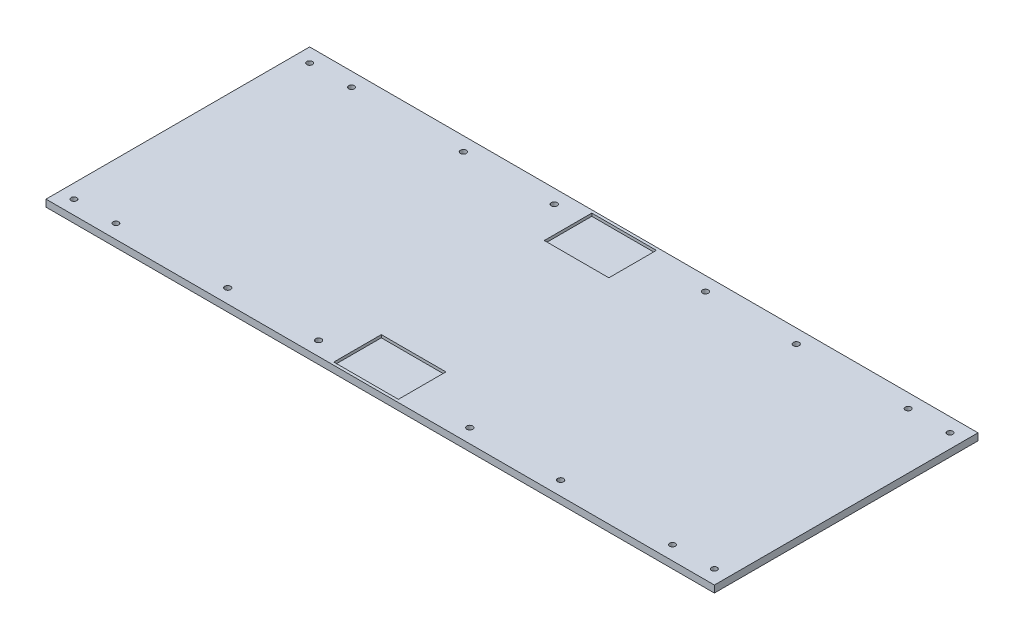
ISO-10303-21;
HEADER;
FILE_DESCRIPTION(('STEP AP214'),'2;1');
FILE_NAME('part.step','',(''),(''),'','','');
FILE_SCHEMA(('AUTOMOTIVE_DESIGN { 1 0 10303 214 1 1 1 1 }'));
ENDSEC;
DATA;
#1=APPLICATION_CONTEXT('core data for automotive mechanical design processes');
#2=APPLICATION_PROTOCOL_DEFINITION('international standard','automotive_design',2000,#1);
#3=PRODUCT_CONTEXT('',#1,'mechanical');
#4=PRODUCT('Part','Part','',(#3));
#5=PRODUCT_RELATED_PRODUCT_CATEGORY('part','',(#4));
#6=PRODUCT_DEFINITION_FORMATION('','',#4);
#7=PRODUCT_DEFINITION_CONTEXT('part definition',#1,'design');
#8=PRODUCT_DEFINITION('design','',#6,#7);
#9=PRODUCT_DEFINITION_SHAPE('','',#8);
#10=(LENGTH_UNIT() NAMED_UNIT(*) SI_UNIT(.MILLI.,.METRE.));
#11=(NAMED_UNIT(*) PLANE_ANGLE_UNIT() SI_UNIT($,.RADIAN.));
#12=(NAMED_UNIT(*) SI_UNIT($,.STERADIAN.) SOLID_ANGLE_UNIT());
#13=UNCERTAINTY_MEASURE_WITH_UNIT(LENGTH_MEASURE(1.E-05),#10,'distance_accuracy_value','');
#14=(GEOMETRIC_REPRESENTATION_CONTEXT(3) GLOBAL_UNCERTAINTY_ASSIGNED_CONTEXT((#13)) GLOBAL_UNIT_ASSIGNED_CONTEXT((#10,
#11,#12)) REPRESENTATION_CONTEXT('',''));
#15=CARTESIAN_POINT('',(0.,0.,0.));
#16=DIRECTION('',(0.,0.,1.));
#17=DIRECTION('',(1.,0.,0.));
#18=AXIS2_PLACEMENT_3D('',#15,#16,#17);
#19=CARTESIAN_POINT('',(0.,5.,0.));
#20=DIRECTION('',(0.,1.,0.));
#21=DIRECTION('',(0.,0.,1.));
#22=AXIS2_PLACEMENT_3D('',#19,#20,#21);
#23=PLANE('',#22);
#24=CARTESIAN_POINT('',(112.082454516112,5.,37.2115683659722));
#25=DIRECTION('',(0.,1.,0.));
#26=DIRECTION('',(0.,0.,1.));
#27=AXIS2_PLACEMENT_3D('',#24,#25,#26);
#28=CIRCLE('',#27,2.1);
#29=CARTESIAN_POINT('',(112.082454516112,5.,39.3115683659722));
#30=VERTEX_POINT('',#29);
#31=EDGE_CURVE('E602',#30,#30,#28,.T.);
#32=ORIENTED_EDGE('',*,*,#31,.F.);
#33=EDGE_LOOP('',(#32));
#34=FACE_BOUND('',#33,.T.);
#35=CARTESIAN_POINT('',(220.236140527521,5.,37.2115683659721));
#36=DIRECTION('',(0.,1.,0.));
#37=DIRECTION('',(0.,0.,1.));
#38=AXIS2_PLACEMENT_3D('',#35,#36,#37);
#39=CIRCLE('',#38,2.09999999999999);
#40=CARTESIAN_POINT('',(220.236140527521,5.,39.3115683659721));
#41=VERTEX_POINT('',#40);
#42=EDGE_CURVE('E597',#41,#41,#39,.T.);
#43=ORIENTED_EDGE('',*,*,#42,.F.);
#44=EDGE_LOOP('',(#43));
#45=FACE_BOUND('',#44,.T.);
#46=CARTESIAN_POINT('',(285.236140527522,5.,37.2115683659722));
#47=DIRECTION('',(0.,1.,0.));
#48=DIRECTION('',(0.,0.,1.));
#49=AXIS2_PLACEMENT_3D('',#46,#47,#48);
#50=CIRCLE('',#49,2.09999999999999);
#51=CARTESIAN_POINT('',(285.236140527522,5.,39.3115683659722));
#52=VERTEX_POINT('',#51);
#53=EDGE_CURVE('E574',#52,#52,#50,.T.);
#54=ORIENTED_EDGE('',*,*,#53,.F.);
#55=EDGE_LOOP('',(#54));
#56=FACE_BOUND('',#55,.T.);
#57=CARTESIAN_POINT('',(220.236140527521,5.,-131.382140187336));
#58=DIRECTION('',(0.,1.,0.));
#59=DIRECTION('',(0.,0.,1.));
#60=AXIS2_PLACEMENT_3D('',#57,#58,#59);
#61=CIRCLE('',#60,2.09999999999999);
#62=CARTESIAN_POINT('',(220.236140527521,5.,-129.282140187336));
#63=VERTEX_POINT('',#62);
#64=EDGE_CURVE('E596',#63,#63,#61,.T.);
#65=ORIENTED_EDGE('',*,*,#64,.F.);
#66=EDGE_LOOP('',(#65));
#67=FACE_BOUND('',#66,.T.);
#68=CARTESIAN_POINT('',(47.0824545161121,5.,37.2115683659721));
#69=DIRECTION('',(0.,1.,0.));
#70=DIRECTION('',(0.,0.,1.));
#71=AXIS2_PLACEMENT_3D('',#68,#69,#70);
#72=CIRCLE('',#71,2.1);
#73=CARTESIAN_POINT('',(47.0824545161121,5.,39.3115683659721));
#74=VERTEX_POINT('',#73);
#75=EDGE_CURVE('E629',#74,#74,#72,.T.);
#76=ORIENTED_EDGE('',*,*,#75,.F.);
#77=EDGE_LOOP('',(#76));
#78=FACE_BOUND('',#77,.T.);
#79=CARTESIAN_POINT('',(47.0824545161121,5.,-131.382140187336));
#80=DIRECTION('',(0.,1.,0.));
#81=DIRECTION('',(0.,0.,1.));
#82=AXIS2_PLACEMENT_3D('',#79,#80,#81);
#83=CIRCLE('',#82,2.09999999999999);
#84=CARTESIAN_POINT('',(47.0824545161121,5.,-129.282140187336));
#85=VERTEX_POINT('',#84);
#86=EDGE_CURVE('E634',#85,#85,#83,.T.);
#87=ORIENTED_EDGE('',*,*,#86,.F.);
#88=EDGE_LOOP('',(#87));
#89=FACE_BOUND('',#88,.T.);
#90=CARTESIAN_POINT('',(112.082454516112,5.,-131.382140187336));
#91=DIRECTION('',(0.,1.,0.));
#92=DIRECTION('',(0.,0.,1.));
#93=AXIS2_PLACEMENT_3D('',#90,#91,#92);
#94=CIRCLE('',#93,2.1);
#95=CARTESIAN_POINT('',(112.082454516112,5.,-129.282140187336));
#96=VERTEX_POINT('',#95);
#97=EDGE_CURVE('E631',#96,#96,#94,.T.);
#98=ORIENTED_EDGE('',*,*,#97,.F.);
#99=EDGE_LOOP('',(#98));
#100=FACE_BOUND('',#99,.T.);
#101=CARTESIAN_POINT('',(285.236140527522,5.,-131.382140187336));
#102=DIRECTION('',(0.,1.,0.));
#103=DIRECTION('',(0.,0.,1.));
#104=AXIS2_PLACEMENT_3D('',#101,#102,#103);
#105=CIRCLE('',#104,2.09999999999999);
#106=CARTESIAN_POINT('',(285.236140527522,5.,-129.282140187336));
#107=VERTEX_POINT('',#106);
#108=EDGE_CURVE('E273',#107,#107,#105,.T.);
#109=ORIENTED_EDGE('',*,*,#108,.F.);
#110=EDGE_LOOP('',(#109));
#111=FACE_BOUND('',#110,.T.);
#112=CARTESIAN_POINT('',(365.236140527522,5.,37.2115683659722));
#113=DIRECTION('',(0.,1.,0.));
#114=DIRECTION('',(0.,0.,1.));
#115=AXIS2_PLACEMENT_3D('',#112,#113,#114);
#116=CIRCLE('',#115,2.);
#117=CARTESIAN_POINT('',(365.236140527522,5.,39.2115683659722));
#118=VERTEX_POINT('',#117);
#119=EDGE_CURVE('E193',#118,#118,#116,.T.);
#120=ORIENTED_EDGE('',*,*,#119,.F.);
#121=EDGE_LOOP('',(#120));
#122=FACE_BOUND('',#121,.T.);
#123=CARTESIAN_POINT('',(365.236140527522,5.,-131.382140187336));
#124=DIRECTION('',(0.,1.,0.));
#125=DIRECTION('',(0.,0.,1.));
#126=AXIS2_PLACEMENT_3D('',#123,#124,#125);
#127=CIRCLE('',#126,2.);
#128=CARTESIAN_POINT('',(365.236140527522,5.,-129.382140187336));
#129=VERTEX_POINT('',#128);
#130=EDGE_CURVE('E196',#129,#129,#127,.T.);
#131=ORIENTED_EDGE('',*,*,#130,.F.);
#132=EDGE_LOOP('',(#131));
#133=FACE_BOUND('',#132,.T.);
#134=CARTESIAN_POINT('',(-32.9175454838879,5.,-131.382140187336));
#135=DIRECTION('',(0.,1.,0.));
#136=DIRECTION('',(0.,0.,1.));
#137=AXIS2_PLACEMENT_3D('',#134,#135,#136);
#138=CIRCLE('',#137,2.);
#139=CARTESIAN_POINT('',(-32.9175454838879,5.,-129.382140187336));
#140=VERTEX_POINT('',#139);
#141=EDGE_CURVE('E200',#140,#140,#138,.T.);
#142=ORIENTED_EDGE('',*,*,#141,.F.);
#143=EDGE_LOOP('',(#142));
#144=FACE_BOUND('',#143,.T.);
#145=CARTESIAN_POINT('',(-32.9175454838879,5.,37.2115683659721));
#146=DIRECTION('',(0.,1.,0.));
#147=DIRECTION('',(0.,0.,1.));
#148=AXIS2_PLACEMENT_3D('',#145,#146,#147);
#149=CIRCLE('',#148,2.);
#150=CARTESIAN_POINT('',(-32.9175454838879,5.,39.2115683659721));
#151=VERTEX_POINT('',#150);
#152=EDGE_CURVE('E203',#151,#151,#149,.T.);
#153=ORIENTED_EDGE('',*,*,#152,.F.);
#154=EDGE_LOOP('',(#153));
#155=FACE_BOUND('',#154,.T.);
#156=CARTESIAN_POINT('',(395.236140527522,5.,-131.382140187336));
#157=DIRECTION('',(0.,1.,0.));
#158=DIRECTION('',(0.,0.,1.));
#159=AXIS2_PLACEMENT_3D('',#156,#157,#158);
#160=CIRCLE('',#159,2.);
#161=CARTESIAN_POINT('',(395.236140527522,5.,-129.382140187336));
#162=VERTEX_POINT('',#161);
#163=EDGE_CURVE('E206',#162,#162,#160,.T.);
#164=ORIENTED_EDGE('',*,*,#163,.F.);
#165=EDGE_LOOP('',(#164));
#166=FACE_BOUND('',#165,.T.);
#167=CARTESIAN_POINT('',(395.236140527521,5.,37.2115683659721));
#168=DIRECTION('',(0.,1.,0.));
#169=DIRECTION('',(0.,0.,1.));
#170=AXIS2_PLACEMENT_3D('',#167,#168,#169);
#171=CIRCLE('',#170,2.);
#172=CARTESIAN_POINT('',(395.236140527521,5.,39.2115683659721));
#173=VERTEX_POINT('',#172);
#174=EDGE_CURVE('E209',#173,#173,#171,.T.);
#175=ORIENTED_EDGE('',*,*,#174,.F.);
#176=EDGE_LOOP('',(#175));
#177=FACE_BOUND('',#176,.T.);
#178=CARTESIAN_POINT('',(-62.9175454838879,5.,37.2115683659721));
#179=DIRECTION('',(0.,1.,0.));
#180=DIRECTION('',(0.,0.,1.));
#181=AXIS2_PLACEMENT_3D('',#178,#179,#180);
#182=CIRCLE('',#181,2.);
#183=CARTESIAN_POINT('',(-62.9175454838879,5.,39.2115683659721));
#184=VERTEX_POINT('',#183);
#185=EDGE_CURVE('E212',#184,#184,#182,.T.);
#186=ORIENTED_EDGE('',*,*,#185,.F.);
#187=EDGE_LOOP('',(#186));
#188=FACE_BOUND('',#187,.T.);
#189=CARTESIAN_POINT('',(-62.9175454838879,5.,-131.382140187336));
#190=DIRECTION('',(0.,1.,0.));
#191=DIRECTION('',(0.,0.,1.));
#192=AXIS2_PLACEMENT_3D('',#189,#190,#191);
#193=CIRCLE('',#192,2.);
#194=CARTESIAN_POINT('',(-62.9175454838879,5.,-129.382140187336));
#195=VERTEX_POINT('',#194);
#196=EDGE_CURVE('E215',#195,#195,#193,.T.);
#197=ORIENTED_EDGE('',*,*,#196,.F.);
#198=EDGE_LOOP('',(#197));
#199=FACE_BOUND('',#198,.T.);
#200=DIRECTION('',(0.,0.,1.));
#201=VECTOR('',#200,1.);
#202=CARTESIAN_POINT('',(405.236140527522,5.,0.));
#203=LINE('',#202,#201);
#204=CARTESIAN_POINT('',(405.236140527522,5.,-141.382140187336));
#205=VERTEX_POINT('',#204);
#206=CARTESIAN_POINT('',(405.236140527522,5.,47.2115683659721));
#207=VERTEX_POINT('',#206);
#208=EDGE_CURVE('E218',#205,#207,#203,.T.);
#209=ORIENTED_EDGE('',*,*,#208,.F.);
#210=DIRECTION('',(1.,0.,0.));
#211=VECTOR('',#210,1.);
#212=CARTESIAN_POINT('',(0.,5.,-141.382140187336));
#213=LINE('',#212,#211);
#214=CARTESIAN_POINT('',(-72.917545483888,5.,-141.382140187336));
#215=VERTEX_POINT('',#214);
#216=EDGE_CURVE('E221',#215,#205,#213,.T.);
#217=ORIENTED_EDGE('',*,*,#216,.F.);
#218=DIRECTION('',(0.,0.,1.));
#219=VECTOR('',#218,1.);
#220=CARTESIAN_POINT('',(-72.9175454838879,5.,0.));
#221=LINE('',#220,#219);
#222=CARTESIAN_POINT('',(-72.9175454838879,5.,47.2115683659722));
#223=VERTEX_POINT('',#222);
#224=EDGE_CURVE('E224',#215,#223,#221,.T.);
#225=ORIENTED_EDGE('',*,*,#224,.T.);
#226=DIRECTION('',(1.,0.,0.));
#227=VECTOR('',#226,1.);
#228=CARTESIAN_POINT('',(0.,5.,47.2115683659722));
#229=LINE('',#228,#227);
#230=EDGE_CURVE('E227',#223,#207,#229,.T.);
#231=ORIENTED_EDGE('',*,*,#230,.T.);
#232=EDGE_LOOP('',(#209,#217,#225,#231));
#233=FACE_BOUND('',#232,.T.);
#234=DIRECTION('',(0.,0.,-1.));
#235=VECTOR('',#234,1.);
#236=CARTESIAN_POINT('',(130.959297521817,5.,0.));
#237=LINE('',#236,#235);
#238=CARTESIAN_POINT('',(130.959297521817,5.,45.2115683659722));
#239=VERTEX_POINT('',#238);
#240=CARTESIAN_POINT('',(130.959297521817,5.,11.2115683659722));
#241=VERTEX_POINT('',#240);
#242=EDGE_CURVE('E179',#239,#241,#237,.T.);
#243=ORIENTED_EDGE('',*,*,#242,.T.);
#244=DIRECTION('',(1.,0.,0.));
#245=VECTOR('',#244,1.);
#246=CARTESIAN_POINT('',(0.,5.,11.2115683659722));
#247=LINE('',#246,#245);
#248=CARTESIAN_POINT('',(177.159297521817,5.,11.2115683659722));
#249=VERTEX_POINT('',#248);
#250=EDGE_CURVE('E60',#241,#249,#247,.T.);
#251=ORIENTED_EDGE('',*,*,#250,.T.);
#252=DIRECTION('',(0.,0.,-1.));
#253=VECTOR('',#252,1.);
#254=CARTESIAN_POINT('',(177.159297521817,5.,0.));
#255=LINE('',#254,#253);
#256=CARTESIAN_POINT('',(177.159297521817,5.,45.2115683659722));
#257=VERTEX_POINT('',#256);
#258=EDGE_CURVE('E170',#257,#249,#255,.T.);
#259=ORIENTED_EDGE('',*,*,#258,.F.);
#260=DIRECTION('',(-1.,0.,0.));
#261=VECTOR('',#260,1.);
#262=CARTESIAN_POINT('',(0.,5.,45.2115683659722));
#263=LINE('',#262,#261);
#264=EDGE_CURVE('E182',#257,#239,#263,.T.);
#265=ORIENTED_EDGE('',*,*,#264,.T.);
#266=EDGE_LOOP('',(#243,#251,#259,#265));
#267=FACE_BOUND('',#266,.T.);
#268=DIRECTION('',(0.,0.,-1.));
#269=VECTOR('',#268,1.);
#270=CARTESIAN_POINT('',(177.159297521817,5.,0.));
#271=LINE('',#270,#269);
#272=CARTESIAN_POINT('',(177.159297521817,5.,-105.382140187336));
#273=VERTEX_POINT('',#272);
#274=CARTESIAN_POINT('',(177.159297521817,5.,-139.382140187336));
#275=VERTEX_POINT('',#274);
#276=EDGE_CURVE('E153',#273,#275,#271,.T.);
#277=ORIENTED_EDGE('',*,*,#276,.F.);
#278=DIRECTION('',(-1.,0.,0.));
#279=VECTOR('',#278,1.);
#280=CARTESIAN_POINT('',(0.,5.,-105.382140187336));
#281=LINE('',#280,#279);
#282=CARTESIAN_POINT('',(130.959297521817,5.,-105.382140187336));
#283=VERTEX_POINT('',#282);
#284=EDGE_CURVE('E52',#273,#283,#281,.T.);
#285=ORIENTED_EDGE('',*,*,#284,.T.);
#286=DIRECTION('',(0.,0.,-1.));
#287=VECTOR('',#286,1.);
#288=CARTESIAN_POINT('',(130.959297521817,5.,0.));
#289=LINE('',#288,#287);
#290=CARTESIAN_POINT('',(130.959297521817,5.,-139.382140187336));
#291=VERTEX_POINT('',#290);
#292=EDGE_CURVE('E142',#283,#291,#289,.T.);
#293=ORIENTED_EDGE('',*,*,#292,.T.);
#294=DIRECTION('',(-1.,0.,0.));
#295=VECTOR('',#294,1.);
#296=CARTESIAN_POINT('',(0.,5.,-139.382140187336));
#297=LINE('',#296,#295);
#298=EDGE_CURVE('E156',#275,#291,#297,.T.);
#299=ORIENTED_EDGE('',*,*,#298,.F.);
#300=EDGE_LOOP('',(#277,#285,#293,#299));
#301=FACE_BOUND('',#300,.T.);
#302=ADVANCED_FACE('F35',(#34,#45,#56,#67,#78,#89,#100,#111,#122,#133,#144,#155,#166,#177,#188,
#199,#233,#267,#301),#23,.T.);
#303=CARTESIAN_POINT('',(405.236140527522,5.,0.));
#304=DIRECTION('',(1.,0.,0.));
#305=DIRECTION('',(0.,0.,-1.));
#306=AXIS2_PLACEMENT_3D('',#303,#304,#305);
#307=PLANE('',#306);
#308=DIRECTION('',(0.,0.,1.));
#309=VECTOR('',#308,1.);
#310=CARTESIAN_POINT('',(405.236140527522,0.,0.));
#311=LINE('',#310,#309);
#312=CARTESIAN_POINT('',(405.236140527522,0.,-141.382140187336));
#313=VERTEX_POINT('',#312);
#314=CARTESIAN_POINT('',(405.236140527522,0.,47.2115683659721));
#315=VERTEX_POINT('',#314);
#316=EDGE_CURVE('E253',#313,#315,#311,.T.);
#317=ORIENTED_EDGE('',*,*,#316,.F.);
#318=DIRECTION('',(0.,-1.,0.));
#319=VECTOR('',#318,1.);
#320=CARTESIAN_POINT('',(405.236140527522,5.,-141.382140187336));
#321=LINE('',#320,#319);
#322=EDGE_CURVE('E11',#205,#313,#321,.T.);
#323=ORIENTED_EDGE('',*,*,#322,.F.);
#324=ORIENTED_EDGE('',*,*,#208,.T.);
#325=DIRECTION('',(0.,-1.,0.));
#326=VECTOR('',#325,1.);
#327=CARTESIAN_POINT('',(405.236140527522,5.,47.2115683659721));
#328=LINE('',#327,#326);
#329=EDGE_CURVE('E229',#207,#315,#328,.T.);
#330=ORIENTED_EDGE('',*,*,#329,.T.);
#331=EDGE_LOOP('',(#317,#323,#324,#330));
#332=FACE_BOUND('',#331,.T.);
#333=ADVANCED_FACE('F310',(#332),#307,.T.);
#334=CARTESIAN_POINT('',(0.,5.,-141.382140187336));
#335=DIRECTION('',(0.,0.,-1.));
#336=DIRECTION('',(-1.,0.,0.));
#337=AXIS2_PLACEMENT_3D('',#334,#335,#336);
#338=PLANE('',#337);
#339=DIRECTION('',(1.,0.,0.));
#340=VECTOR('',#339,1.);
#341=CARTESIAN_POINT('',(0.,0.,-141.382140187336));
#342=LINE('',#341,#340);
#343=CARTESIAN_POINT('',(-72.917545483888,0.,-141.382140187336));
#344=VERTEX_POINT('',#343);
#345=EDGE_CURVE('E256',#344,#313,#342,.T.);
#346=ORIENTED_EDGE('',*,*,#345,.F.);
#347=DIRECTION('',(0.,-1.,0.));
#348=VECTOR('',#347,1.);
#349=CARTESIAN_POINT('',(-72.917545483888,5.,-141.382140187336));
#350=LINE('',#349,#348);
#351=EDGE_CURVE('E44',#215,#344,#350,.T.);
#352=ORIENTED_EDGE('',*,*,#351,.F.);
#353=ORIENTED_EDGE('',*,*,#216,.T.);
#354=ORIENTED_EDGE('',*,*,#322,.T.);
#355=EDGE_LOOP('',(#346,#352,#353,#354));
#356=FACE_BOUND('',#355,.T.);
#357=ADVANCED_FACE('F318',(#356),#338,.T.);
#358=CARTESIAN_POINT('',(-72.9175454838879,5.,0.));
#359=DIRECTION('',(1.,0.,0.));
#360=DIRECTION('',(0.,0.,-1.));
#361=AXIS2_PLACEMENT_3D('',#358,#359,#360);
#362=PLANE('',#361);
#363=DIRECTION('',(0.,0.,1.));
#364=VECTOR('',#363,1.);
#365=CARTESIAN_POINT('',(-72.9175454838879,0.,0.));
#366=LINE('',#365,#364);
#367=CARTESIAN_POINT('',(-72.9175454838879,0.,47.2115683659722));
#368=VERTEX_POINT('',#367);
#369=EDGE_CURVE('E259',#344,#368,#366,.T.);
#370=ORIENTED_EDGE('',*,*,#369,.T.);
#371=DIRECTION('',(0.,-1.,0.));
#372=VECTOR('',#371,1.);
#373=CARTESIAN_POINT('',(-72.9175454838879,5.,47.2115683659722));
#374=LINE('',#373,#372);
#375=EDGE_CURVE('E265',#223,#368,#374,.T.);
#376=ORIENTED_EDGE('',*,*,#375,.F.);
#377=ORIENTED_EDGE('',*,*,#224,.F.);
#378=ORIENTED_EDGE('',*,*,#351,.T.);
#379=EDGE_LOOP('',(#370,#376,#377,#378));
#380=FACE_BOUND('',#379,.T.);
#381=ADVANCED_FACE('F332',(#380),#362,.F.);
#382=CARTESIAN_POINT('',(-62.9175454838879,5.,-131.382140187336));
#383=DIRECTION('',(0.,-1.,0.));
#384=DIRECTION('',(0.,0.,-1.));
#385=AXIS2_PLACEMENT_3D('',#382,#383,#384);
#386=CYLINDRICAL_SURFACE('',#385,2.);
#387=ORIENTED_EDGE('',*,*,#196,.T.);
#388=EDGE_LOOP('',(#387));
#389=FACE_BOUND('',#388,.T.);
#390=CARTESIAN_POINT('',(-62.9175454838879,0.,-131.382140187336));
#391=DIRECTION('',(0.,1.,0.));
#392=DIRECTION('',(0.,0.,1.));
#393=AXIS2_PLACEMENT_3D('',#390,#391,#392);
#394=CIRCLE('',#393,2.);
#395=CARTESIAN_POINT('',(-62.9175454838879,0.,-129.382140187336));
#396=VERTEX_POINT('',#395);
#397=EDGE_CURVE('E250',#396,#396,#394,.T.);
#398=ORIENTED_EDGE('',*,*,#397,.F.);
#399=EDGE_LOOP('',(#398));
#400=FACE_BOUND('',#399,.T.);
#401=ADVANCED_FACE('F335',(#389,#400),#386,.F.);
#402=CARTESIAN_POINT('',(-62.9175454838879,5.,37.2115683659721));
#403=DIRECTION('',(0.,-1.,0.));
#404=DIRECTION('',(0.,0.,-1.));
#405=AXIS2_PLACEMENT_3D('',#402,#403,#404);
#406=CYLINDRICAL_SURFACE('',#405,2.);
#407=ORIENTED_EDGE('',*,*,#185,.T.);
#408=EDGE_LOOP('',(#407));
#409=FACE_BOUND('',#408,.T.);
#410=CARTESIAN_POINT('',(-62.9175454838879,0.,37.2115683659721));
#411=DIRECTION('',(0.,1.,0.));
#412=DIRECTION('',(0.,0.,1.));
#413=AXIS2_PLACEMENT_3D('',#410,#411,#412);
#414=CIRCLE('',#413,2.);
#415=CARTESIAN_POINT('',(-62.9175454838879,0.,39.2115683659721));
#416=VERTEX_POINT('',#415);
#417=EDGE_CURVE('E247',#416,#416,#414,.T.);
#418=ORIENTED_EDGE('',*,*,#417,.F.);
#419=EDGE_LOOP('',(#418));
#420=FACE_BOUND('',#419,.T.);
#421=ADVANCED_FACE('F342',(#409,#420),#406,.F.);
#422=CARTESIAN_POINT('',(395.236140527521,5.,37.2115683659721));
#423=DIRECTION('',(0.,-1.,0.));
#424=DIRECTION('',(0.,0.,-1.));
#425=AXIS2_PLACEMENT_3D('',#422,#423,#424);
#426=CYLINDRICAL_SURFACE('',#425,2.);
#427=ORIENTED_EDGE('',*,*,#174,.T.);
#428=EDGE_LOOP('',(#427));
#429=FACE_BOUND('',#428,.T.);
#430=CARTESIAN_POINT('',(395.236140527521,0.,37.2115683659721));
#431=DIRECTION('',(0.,1.,0.));
#432=DIRECTION('',(0.,0.,1.));
#433=AXIS2_PLACEMENT_3D('',#430,#431,#432);
#434=CIRCLE('',#433,2.);
#435=CARTESIAN_POINT('',(395.236140527521,0.,39.2115683659721));
#436=VERTEX_POINT('',#435);
#437=EDGE_CURVE('E244',#436,#436,#434,.T.);
#438=ORIENTED_EDGE('',*,*,#437,.F.);
#439=EDGE_LOOP('',(#438));
#440=FACE_BOUND('',#439,.T.);
#441=ADVANCED_FACE('F346',(#429,#440),#426,.F.);
#442=CARTESIAN_POINT('',(395.236140527522,5.,-131.382140187336));
#443=DIRECTION('',(0.,-1.,0.));
#444=DIRECTION('',(0.,0.,-1.));
#445=AXIS2_PLACEMENT_3D('',#442,#443,#444);
#446=CYLINDRICAL_SURFACE('',#445,2.);
#447=ORIENTED_EDGE('',*,*,#163,.T.);
#448=EDGE_LOOP('',(#447));
#449=FACE_BOUND('',#448,.T.);
#450=CARTESIAN_POINT('',(395.236140527522,0.,-131.382140187336));
#451=DIRECTION('',(0.,1.,0.));
#452=DIRECTION('',(0.,0.,1.));
#453=AXIS2_PLACEMENT_3D('',#450,#451,#452);
#454=CIRCLE('',#453,2.);
#455=CARTESIAN_POINT('',(395.236140527522,0.,-129.382140187336));
#456=VERTEX_POINT('',#455);
#457=EDGE_CURVE('E241',#456,#456,#454,.T.);
#458=ORIENTED_EDGE('',*,*,#457,.F.);
#459=EDGE_LOOP('',(#458));
#460=FACE_BOUND('',#459,.T.);
#461=ADVANCED_FACE('F350',(#449,#460),#446,.F.);
#462=CARTESIAN_POINT('',(-32.9175454838879,5.,37.2115683659721));
#463=DIRECTION('',(0.,-1.,0.));
#464=DIRECTION('',(0.,0.,-1.));
#465=AXIS2_PLACEMENT_3D('',#462,#463,#464);
#466=CYLINDRICAL_SURFACE('',#465,2.);
#467=ORIENTED_EDGE('',*,*,#152,.T.);
#468=EDGE_LOOP('',(#467));
#469=FACE_BOUND('',#468,.T.);
#470=CARTESIAN_POINT('',(-32.9175454838879,0.,37.2115683659721));
#471=DIRECTION('',(0.,1.,0.));
#472=DIRECTION('',(0.,0.,1.));
#473=AXIS2_PLACEMENT_3D('',#470,#471,#472);
#474=CIRCLE('',#473,2.);
#475=CARTESIAN_POINT('',(-32.9175454838879,0.,39.2115683659721));
#476=VERTEX_POINT('',#475);
#477=EDGE_CURVE('E238',#476,#476,#474,.T.);
#478=ORIENTED_EDGE('',*,*,#477,.F.);
#479=EDGE_LOOP('',(#478));
#480=FACE_BOUND('',#479,.T.);
#481=ADVANCED_FACE('F354',(#469,#480),#466,.F.);
#482=CARTESIAN_POINT('',(-32.9175454838879,5.,-131.382140187336));
#483=DIRECTION('',(0.,-1.,0.));
#484=DIRECTION('',(0.,0.,-1.));
#485=AXIS2_PLACEMENT_3D('',#482,#483,#484);
#486=CYLINDRICAL_SURFACE('',#485,2.);
#487=ORIENTED_EDGE('',*,*,#141,.T.);
#488=EDGE_LOOP('',(#487));
#489=FACE_BOUND('',#488,.T.);
#490=CARTESIAN_POINT('',(-32.9175454838879,0.,-131.382140187336));
#491=DIRECTION('',(0.,1.,0.));
#492=DIRECTION('',(0.,0.,1.));
#493=AXIS2_PLACEMENT_3D('',#490,#491,#492);
#494=CIRCLE('',#493,2.);
#495=CARTESIAN_POINT('',(-32.9175454838879,0.,-129.382140187336));
#496=VERTEX_POINT('',#495);
#497=EDGE_CURVE('E235',#496,#496,#494,.T.);
#498=ORIENTED_EDGE('',*,*,#497,.F.);
#499=EDGE_LOOP('',(#498));
#500=FACE_BOUND('',#499,.T.);
#501=ADVANCED_FACE('F358',(#489,#500),#486,.F.);
#502=CARTESIAN_POINT('',(365.236140527522,5.,-131.382140187336));
#503=DIRECTION('',(0.,-1.,0.));
#504=DIRECTION('',(0.,0.,-1.));
#505=AXIS2_PLACEMENT_3D('',#502,#503,#504);
#506=CYLINDRICAL_SURFACE('',#505,2.);
#507=ORIENTED_EDGE('',*,*,#130,.T.);
#508=EDGE_LOOP('',(#507));
#509=FACE_BOUND('',#508,.T.);
#510=CARTESIAN_POINT('',(365.236140527522,0.,-131.382140187336));
#511=DIRECTION('',(0.,1.,0.));
#512=DIRECTION('',(0.,0.,1.));
#513=AXIS2_PLACEMENT_3D('',#510,#511,#512);
#514=CIRCLE('',#513,2.);
#515=CARTESIAN_POINT('',(365.236140527522,0.,-129.382140187336));
#516=VERTEX_POINT('',#515);
#517=EDGE_CURVE('E232',#516,#516,#514,.T.);
#518=ORIENTED_EDGE('',*,*,#517,.F.);
#519=EDGE_LOOP('',(#518));
#520=FACE_BOUND('',#519,.T.);
#521=ADVANCED_FACE('F361',(#509,#520),#506,.F.);
#522=CARTESIAN_POINT('',(365.236140527522,5.,37.2115683659722));
#523=DIRECTION('',(0.,-1.,0.));
#524=DIRECTION('',(0.,0.,-1.));
#525=AXIS2_PLACEMENT_3D('',#522,#523,#524);
#526=CYLINDRICAL_SURFACE('',#525,2.);
#527=ORIENTED_EDGE('',*,*,#119,.T.);
#528=EDGE_LOOP('',(#527));
#529=FACE_BOUND('',#528,.T.);
#530=CARTESIAN_POINT('',(365.236140527522,0.,37.2115683659722));
#531=DIRECTION('',(0.,1.,0.));
#532=DIRECTION('',(0.,0.,1.));
#533=AXIS2_PLACEMENT_3D('',#530,#531,#532);
#534=CIRCLE('',#533,2.);
#535=CARTESIAN_POINT('',(365.236140527522,0.,39.2115683659722));
#536=VERTEX_POINT('',#535);
#537=EDGE_CURVE('E163',#536,#536,#534,.T.);
#538=ORIENTED_EDGE('',*,*,#537,.F.);
#539=EDGE_LOOP('',(#538));
#540=FACE_BOUND('',#539,.T.);
#541=ADVANCED_FACE('F37',(#529,#540),#526,.F.);
#542=CARTESIAN_POINT('',(0.,5.,47.2115683659722));
#543=DIRECTION('',(0.,0.,-1.));
#544=DIRECTION('',(-1.,0.,0.));
#545=AXIS2_PLACEMENT_3D('',#542,#543,#544);
#546=PLANE('',#545);
#547=DIRECTION('',(1.,0.,0.));
#548=VECTOR('',#547,1.);
#549=CARTESIAN_POINT('',(0.,0.,47.2115683659722));
#550=LINE('',#549,#548);
#551=EDGE_CURVE('E197',#368,#315,#550,.T.);
#552=ORIENTED_EDGE('',*,*,#551,.T.);
#553=ORIENTED_EDGE('',*,*,#329,.F.);
#554=ORIENTED_EDGE('',*,*,#230,.F.);
#555=ORIENTED_EDGE('',*,*,#375,.T.);
#556=EDGE_LOOP('',(#552,#553,#554,#555));
#557=FACE_BOUND('',#556,.T.);
#558=ADVANCED_FACE('F328',(#557),#546,.F.);
#559=CARTESIAN_POINT('',(0.,0.,0.));
#560=DIRECTION('',(0.,1.,0.));
#561=DIRECTION('',(0.,0.,1.));
#562=AXIS2_PLACEMENT_3D('',#559,#560,#561);
#563=PLANE('',#562);
#564=CARTESIAN_POINT('',(112.082454516112,0.,37.2115683659722));
#565=DIRECTION('',(0.,1.,0.));
#566=DIRECTION('',(0.,0.,1.));
#567=AXIS2_PLACEMENT_3D('',#564,#565,#566);
#568=CIRCLE('',#567,2.1);
#569=CARTESIAN_POINT('',(112.082454516112,0.,39.3115683659722));
#570=VERTEX_POINT('',#569);
#571=EDGE_CURVE('E39',#570,#570,#568,.T.);
#572=ORIENTED_EDGE('',*,*,#571,.T.);
#573=EDGE_LOOP('',(#572));
#574=FACE_BOUND('',#573,.T.);
#575=CARTESIAN_POINT('',(220.236140527521,0.,37.2115683659721));
#576=DIRECTION('',(0.,1.,0.));
#577=DIRECTION('',(0.,0.,1.));
#578=AXIS2_PLACEMENT_3D('',#575,#576,#577);
#579=CIRCLE('',#578,2.09999999999999);
#580=CARTESIAN_POINT('',(220.236140527521,0.,39.3115683659721));
#581=VERTEX_POINT('',#580);
#582=EDGE_CURVE('E287',#581,#581,#579,.T.);
#583=ORIENTED_EDGE('',*,*,#582,.T.);
#584=EDGE_LOOP('',(#583));
#585=FACE_BOUND('',#584,.T.);
#586=CARTESIAN_POINT('',(285.236140527522,0.,37.2115683659722));
#587=DIRECTION('',(0.,1.,0.));
#588=DIRECTION('',(0.,0.,1.));
#589=AXIS2_PLACEMENT_3D('',#586,#587,#588);
#590=CIRCLE('',#589,2.09999999999999);
#591=CARTESIAN_POINT('',(285.236140527522,0.,39.3115683659722));
#592=VERTEX_POINT('',#591);
#593=EDGE_CURVE('E285',#592,#592,#590,.T.);
#594=ORIENTED_EDGE('',*,*,#593,.T.);
#595=EDGE_LOOP('',(#594));
#596=FACE_BOUND('',#595,.T.);
#597=CARTESIAN_POINT('',(220.236140527521,0.,-131.382140187336));
#598=DIRECTION('',(0.,1.,0.));
#599=DIRECTION('',(0.,0.,1.));
#600=AXIS2_PLACEMENT_3D('',#597,#598,#599);
#601=CIRCLE('',#600,2.09999999999999);
#602=CARTESIAN_POINT('',(220.236140527521,0.,-129.282140187336));
#603=VERTEX_POINT('',#602);
#604=EDGE_CURVE('E282',#603,#603,#601,.T.);
#605=ORIENTED_EDGE('',*,*,#604,.T.);
#606=EDGE_LOOP('',(#605));
#607=FACE_BOUND('',#606,.T.);
#608=CARTESIAN_POINT('',(47.0824545161121,0.,37.2115683659721));
#609=DIRECTION('',(0.,1.,0.));
#610=DIRECTION('',(0.,0.,1.));
#611=AXIS2_PLACEMENT_3D('',#608,#609,#610);
#612=CIRCLE('',#611,2.1);
#613=CARTESIAN_POINT('',(47.0824545161121,0.,39.3115683659721));
#614=VERTEX_POINT('',#613);
#615=EDGE_CURVE('E279',#614,#614,#612,.T.);
#616=ORIENTED_EDGE('',*,*,#615,.T.);
#617=EDGE_LOOP('',(#616));
#618=FACE_BOUND('',#617,.T.);
#619=CARTESIAN_POINT('',(47.0824545161121,0.,-131.382140187336));
#620=DIRECTION('',(0.,1.,0.));
#621=DIRECTION('',(0.,0.,1.));
#622=AXIS2_PLACEMENT_3D('',#619,#620,#621);
#623=CIRCLE('',#622,2.09999999999999);
#624=CARTESIAN_POINT('',(47.0824545161121,0.,-129.282140187336));
#625=VERTEX_POINT('',#624);
#626=EDGE_CURVE('E276',#625,#625,#623,.T.);
#627=ORIENTED_EDGE('',*,*,#626,.T.);
#628=EDGE_LOOP('',(#627));
#629=FACE_BOUND('',#628,.T.);
#630=CARTESIAN_POINT('',(112.082454516112,0.,-131.382140187336));
#631=DIRECTION('',(0.,1.,0.));
#632=DIRECTION('',(0.,0.,1.));
#633=AXIS2_PLACEMENT_3D('',#630,#631,#632);
#634=CIRCLE('',#633,2.1);
#635=CARTESIAN_POINT('',(112.082454516112,0.,-129.282140187336));
#636=VERTEX_POINT('',#635);
#637=EDGE_CURVE('E272',#636,#636,#634,.T.);
#638=ORIENTED_EDGE('',*,*,#637,.T.);
#639=EDGE_LOOP('',(#638));
#640=FACE_BOUND('',#639,.T.);
#641=CARTESIAN_POINT('',(285.236140527522,0.,-131.382140187336));
#642=DIRECTION('',(0.,1.,0.));
#643=DIRECTION('',(0.,0.,1.));
#644=AXIS2_PLACEMENT_3D('',#641,#642,#643);
#645=CIRCLE('',#644,2.09999999999999);
#646=CARTESIAN_POINT('',(285.236140527522,0.,-129.282140187336));
#647=VERTEX_POINT('',#646);
#648=EDGE_CURVE('E269',#647,#647,#645,.T.);
#649=ORIENTED_EDGE('',*,*,#648,.T.);
#650=EDGE_LOOP('',(#649));
#651=FACE_BOUND('',#650,.T.);
#652=ORIENTED_EDGE('',*,*,#537,.T.);
#653=EDGE_LOOP('',(#652));
#654=FACE_BOUND('',#653,.T.);
#655=ORIENTED_EDGE('',*,*,#517,.T.);
#656=EDGE_LOOP('',(#655));
#657=FACE_BOUND('',#656,.T.);
#658=ORIENTED_EDGE('',*,*,#497,.T.);
#659=EDGE_LOOP('',(#658));
#660=FACE_BOUND('',#659,.T.);
#661=ORIENTED_EDGE('',*,*,#477,.T.);
#662=EDGE_LOOP('',(#661));
#663=FACE_BOUND('',#662,.T.);
#664=ORIENTED_EDGE('',*,*,#457,.T.);
#665=EDGE_LOOP('',(#664));
#666=FACE_BOUND('',#665,.T.);
#667=ORIENTED_EDGE('',*,*,#437,.T.);
#668=EDGE_LOOP('',(#667));
#669=FACE_BOUND('',#668,.T.);
#670=ORIENTED_EDGE('',*,*,#417,.T.);
#671=EDGE_LOOP('',(#670));
#672=FACE_BOUND('',#671,.T.);
#673=ORIENTED_EDGE('',*,*,#397,.T.);
#674=EDGE_LOOP('',(#673));
#675=FACE_BOUND('',#674,.T.);
#676=ORIENTED_EDGE('',*,*,#316,.T.);
#677=ORIENTED_EDGE('',*,*,#551,.F.);
#678=ORIENTED_EDGE('',*,*,#369,.F.);
#679=ORIENTED_EDGE('',*,*,#345,.T.);
#680=EDGE_LOOP('',(#676,#677,#678,#679));
#681=FACE_BOUND('',#680,.T.);
#682=ADVANCED_FACE('F294',(#574,#585,#596,#607,#618,#629,#640,#651,#654,#657,#660,#663,#666,
#669,#672,#675,#681),#563,.F.);
#683=CARTESIAN_POINT('',(0.,3.,11.2115683659722));
#684=DIRECTION('',(0.,0.,1.));
#685=DIRECTION('',(1.,0.,0.));
#686=AXIS2_PLACEMENT_3D('',#683,#684,#685);
#687=PLANE('',#686);
#688=ORIENTED_EDGE('',*,*,#250,.F.);
#689=DIRECTION('',(0.,1.,0.));
#690=VECTOR('',#689,1.);
#691=CARTESIAN_POINT('',(130.959297521817,3.,11.2115683659722));
#692=LINE('',#691,#690);
#693=CARTESIAN_POINT('',(130.959297521817,3.,11.2115683659722));
#694=VERTEX_POINT('',#693);
#695=EDGE_CURVE('E177',#694,#241,#692,.T.);
#696=ORIENTED_EDGE('',*,*,#695,.F.);
#697=DIRECTION('',(1.,0.,0.));
#698=VECTOR('',#697,1.);
#699=CARTESIAN_POINT('',(0.,3.,11.2115683659722));
#700=LINE('',#699,#698);
#701=CARTESIAN_POINT('',(177.159297521817,3.,11.2115683659722));
#702=VERTEX_POINT('',#701);
#703=EDGE_CURVE('E167',#694,#702,#700,.T.);
#704=ORIENTED_EDGE('',*,*,#703,.T.);
#705=DIRECTION('',(0.,1.,0.));
#706=VECTOR('',#705,1.);
#707=CARTESIAN_POINT('',(177.159297521817,3.,11.2115683659722));
#708=LINE('',#707,#706);
#709=EDGE_CURVE('E154',#702,#249,#708,.T.);
#710=ORIENTED_EDGE('',*,*,#709,.T.);
#711=EDGE_LOOP('',(#688,#696,#704,#710));
#712=FACE_BOUND('',#711,.T.);
#713=ADVANCED_FACE('F325',(#712),#687,.T.);
#714=CARTESIAN_POINT('',(177.159297521817,3.,0.));
#715=DIRECTION('',(1.,0.,0.));
#716=DIRECTION('',(0.,0.,-1.));
#717=AXIS2_PLACEMENT_3D('',#714,#715,#716);
#718=PLANE('',#717);
#719=ORIENTED_EDGE('',*,*,#258,.T.);
#720=ORIENTED_EDGE('',*,*,#709,.F.);
#721=DIRECTION('',(0.,0.,-1.));
#722=VECTOR('',#721,1.);
#723=CARTESIAN_POINT('',(177.159297521817,3.,0.));
#724=LINE('',#723,#722);
#725=CARTESIAN_POINT('',(177.159297521817,3.,45.2115683659722));
#726=VERTEX_POINT('',#725);
#727=EDGE_CURVE('E174',#726,#702,#724,.T.);
#728=ORIENTED_EDGE('',*,*,#727,.F.);
#729=DIRECTION('',(0.,1.,0.));
#730=VECTOR('',#729,1.);
#731=CARTESIAN_POINT('',(177.159297521817,3.,45.2115683659722));
#732=LINE('',#731,#730);
#733=EDGE_CURVE('E188',#726,#257,#732,.T.);
#734=ORIENTED_EDGE('',*,*,#733,.T.);
#735=EDGE_LOOP('',(#719,#720,#728,#734));
#736=FACE_BOUND('',#735,.T.);
#737=ADVANCED_FACE('F422',(#736),#718,.F.);
#738=CARTESIAN_POINT('',(0.,3.,45.2115683659722));
#739=DIRECTION('',(0.,0.,-1.));
#740=DIRECTION('',(-1.,0.,0.));
#741=AXIS2_PLACEMENT_3D('',#738,#739,#740);
#742=PLANE('',#741);
#743=ORIENTED_EDGE('',*,*,#264,.F.);
#744=ORIENTED_EDGE('',*,*,#733,.F.);
#745=DIRECTION('',(-1.,0.,0.));
#746=VECTOR('',#745,1.);
#747=CARTESIAN_POINT('',(0.,3.,45.2115683659722));
#748=LINE('',#747,#746);
#749=CARTESIAN_POINT('',(130.959297521817,3.,45.2115683659722));
#750=VERTEX_POINT('',#749);
#751=EDGE_CURVE('E172',#726,#750,#748,.T.);
#752=ORIENTED_EDGE('',*,*,#751,.T.);
#753=DIRECTION('',(0.,1.,0.));
#754=VECTOR('',#753,1.);
#755=CARTESIAN_POINT('',(130.959297521817,3.,45.2115683659722));
#756=LINE('',#755,#754);
#757=EDGE_CURVE('E190',#750,#239,#756,.T.);
#758=ORIENTED_EDGE('',*,*,#757,.T.);
#759=EDGE_LOOP('',(#743,#744,#752,#758));
#760=FACE_BOUND('',#759,.T.);
#761=ADVANCED_FACE('F425',(#760),#742,.T.);
#762=CARTESIAN_POINT('',(130.959297521817,3.,0.));
#763=DIRECTION('',(1.,0.,0.));
#764=DIRECTION('',(0.,0.,-1.));
#765=AXIS2_PLACEMENT_3D('',#762,#763,#764);
#766=PLANE('',#765);
#767=ORIENTED_EDGE('',*,*,#242,.F.);
#768=ORIENTED_EDGE('',*,*,#757,.F.);
#769=DIRECTION('',(0.,0.,-1.));
#770=VECTOR('',#769,1.);
#771=CARTESIAN_POINT('',(130.959297521817,3.,0.));
#772=LINE('',#771,#770);
#773=EDGE_CURVE('E169',#750,#694,#772,.T.);
#774=ORIENTED_EDGE('',*,*,#773,.T.);
#775=ORIENTED_EDGE('',*,*,#695,.T.);
#776=EDGE_LOOP('',(#767,#768,#774,#775));
#777=FACE_BOUND('',#776,.T.);
#778=ADVANCED_FACE('F420',(#777),#766,.T.);
#779=CARTESIAN_POINT('',(0.,3.,0.));
#780=DIRECTION('',(0.,1.,0.));
#781=DIRECTION('',(0.,0.,1.));
#782=AXIS2_PLACEMENT_3D('',#779,#780,#781);
#783=PLANE('',#782);
#784=ORIENTED_EDGE('',*,*,#703,.F.);
#785=ORIENTED_EDGE('',*,*,#773,.F.);
#786=ORIENTED_EDGE('',*,*,#751,.F.);
#787=ORIENTED_EDGE('',*,*,#727,.T.);
#788=EDGE_LOOP('',(#784,#785,#786,#787));
#789=FACE_BOUND('',#788,.T.);
#790=ADVANCED_FACE('F411',(#789),#783,.T.);
#791=CARTESIAN_POINT('',(0.,3.,-105.382140187336));
#792=DIRECTION('',(0.,0.,-1.));
#793=DIRECTION('',(-1.,0.,0.));
#794=AXIS2_PLACEMENT_3D('',#791,#792,#793);
#795=PLANE('',#794);
#796=ORIENTED_EDGE('',*,*,#284,.F.);
#797=DIRECTION('',(0.,1.,0.));
#798=VECTOR('',#797,1.);
#799=CARTESIAN_POINT('',(177.159297521817,3.,-105.382140187336));
#800=LINE('',#799,#798);
#801=CARTESIAN_POINT('',(177.159297521817,3.,-105.382140187336));
#802=VERTEX_POINT('',#801);
#803=EDGE_CURVE('E125',#802,#273,#800,.T.);
#804=ORIENTED_EDGE('',*,*,#803,.F.);
#805=DIRECTION('',(-1.,0.,0.));
#806=VECTOR('',#805,1.);
#807=CARTESIAN_POINT('',(0.,3.,-105.382140187336));
#808=LINE('',#807,#806);
#809=CARTESIAN_POINT('',(130.959297521817,3.,-105.382140187336));
#810=VERTEX_POINT('',#809);
#811=EDGE_CURVE('E128',#802,#810,#808,.T.);
#812=ORIENTED_EDGE('',*,*,#811,.T.);
#813=DIRECTION('',(0.,1.,0.));
#814=VECTOR('',#813,1.);
#815=CARTESIAN_POINT('',(130.959297521817,3.,-105.382140187336));
#816=LINE('',#815,#814);
#817=EDGE_CURVE('E161',#810,#283,#816,.T.);
#818=ORIENTED_EDGE('',*,*,#817,.T.);
#819=EDGE_LOOP('',(#796,#804,#812,#818));
#820=FACE_BOUND('',#819,.T.);
#821=ADVANCED_FACE('F127',(#820),#795,.T.);
#822=CARTESIAN_POINT('',(130.959297521817,3.,0.));
#823=DIRECTION('',(1.,0.,0.));
#824=DIRECTION('',(0.,0.,-1.));
#825=AXIS2_PLACEMENT_3D('',#822,#823,#824);
#826=PLANE('',#825);
#827=ORIENTED_EDGE('',*,*,#292,.F.);
#828=ORIENTED_EDGE('',*,*,#817,.F.);
#829=DIRECTION('',(0.,0.,-1.));
#830=VECTOR('',#829,1.);
#831=CARTESIAN_POINT('',(130.959297521817,3.,0.));
#832=LINE('',#831,#830);
#833=CARTESIAN_POINT('',(130.959297521817,3.,-139.382140187336));
#834=VERTEX_POINT('',#833);
#835=EDGE_CURVE('E135',#810,#834,#832,.T.);
#836=ORIENTED_EDGE('',*,*,#835,.T.);
#837=DIRECTION('',(0.,1.,0.));
#838=VECTOR('',#837,1.);
#839=CARTESIAN_POINT('',(130.959297521817,3.,-139.382140187336));
#840=LINE('',#839,#838);
#841=EDGE_CURVE('E164',#834,#291,#840,.T.);
#842=ORIENTED_EDGE('',*,*,#841,.T.);
#843=EDGE_LOOP('',(#827,#828,#836,#842));
#844=FACE_BOUND('',#843,.T.);
#845=ADVANCED_FACE('F403',(#844),#826,.T.);
#846=CARTESIAN_POINT('',(0.,3.,-139.382140187336));
#847=DIRECTION('',(0.,0.,-1.));
#848=DIRECTION('',(-1.,0.,0.));
#849=AXIS2_PLACEMENT_3D('',#846,#847,#848);
#850=PLANE('',#849);
#851=ORIENTED_EDGE('',*,*,#298,.T.);
#852=ORIENTED_EDGE('',*,*,#841,.F.);
#853=DIRECTION('',(-1.,0.,0.));
#854=VECTOR('',#853,1.);
#855=CARTESIAN_POINT('',(0.,3.,-139.382140187336));
#856=LINE('',#855,#854);
#857=CARTESIAN_POINT('',(177.159297521817,3.,-139.382140187336));
#858=VERTEX_POINT('',#857);
#859=EDGE_CURVE('E146',#858,#834,#856,.T.);
#860=ORIENTED_EDGE('',*,*,#859,.F.);
#861=DIRECTION('',(0.,1.,0.));
#862=VECTOR('',#861,1.);
#863=CARTESIAN_POINT('',(177.159297521817,3.,-139.382140187336));
#864=LINE('',#863,#862);
#865=EDGE_CURVE('E134',#858,#275,#864,.T.);
#866=ORIENTED_EDGE('',*,*,#865,.T.);
#867=EDGE_LOOP('',(#851,#852,#860,#866));
#868=FACE_BOUND('',#867,.T.);
#869=ADVANCED_FACE('F401',(#868),#850,.F.);
#870=CARTESIAN_POINT('',(177.159297521817,3.,0.));
#871=DIRECTION('',(1.,0.,0.));
#872=DIRECTION('',(0.,0.,-1.));
#873=AXIS2_PLACEMENT_3D('',#870,#871,#872);
#874=PLANE('',#873);
#875=ORIENTED_EDGE('',*,*,#276,.T.);
#876=ORIENTED_EDGE('',*,*,#865,.F.);
#877=DIRECTION('',(0.,0.,-1.));
#878=VECTOR('',#877,1.);
#879=CARTESIAN_POINT('',(177.159297521817,3.,0.));
#880=LINE('',#879,#878);
#881=EDGE_CURVE('E141',#802,#858,#880,.T.);
#882=ORIENTED_EDGE('',*,*,#881,.F.);
#883=ORIENTED_EDGE('',*,*,#803,.T.);
#884=EDGE_LOOP('',(#875,#876,#882,#883));
#885=FACE_BOUND('',#884,.T.);
#886=ADVANCED_FACE('F144',(#885),#874,.F.);
#887=CARTESIAN_POINT('',(0.,3.,0.));
#888=DIRECTION('',(0.,1.,0.));
#889=DIRECTION('',(0.,0.,1.));
#890=AXIS2_PLACEMENT_3D('',#887,#888,#889);
#891=PLANE('',#890);
#892=ORIENTED_EDGE('',*,*,#811,.F.);
#893=ORIENTED_EDGE('',*,*,#881,.T.);
#894=ORIENTED_EDGE('',*,*,#859,.T.);
#895=ORIENTED_EDGE('',*,*,#835,.F.);
#896=EDGE_LOOP('',(#892,#893,#894,#895));
#897=FACE_BOUND('',#896,.T.);
#898=ADVANCED_FACE('F139',(#897),#891,.T.);
#899=CARTESIAN_POINT('',(285.236140527522,-5.,-131.382140187336));
#900=DIRECTION('',(0.,1.,0.));
#901=DIRECTION('',(0.,0.,1.));
#902=AXIS2_PLACEMENT_3D('',#899,#900,#901);
#903=CYLINDRICAL_SURFACE('',#902,2.09999999999999);
#904=ORIENTED_EDGE('',*,*,#108,.T.);
#905=EDGE_LOOP('',(#904));
#906=FACE_BOUND('',#905,.T.);
#907=ORIENTED_EDGE('',*,*,#648,.F.);
#908=EDGE_LOOP('',(#907));
#909=FACE_BOUND('',#908,.T.);
#910=ADVANCED_FACE('F501',(#906,#909),#903,.F.);
#911=CARTESIAN_POINT('',(112.082454516112,-5.,-131.382140187336));
#912=DIRECTION('',(0.,1.,0.));
#913=DIRECTION('',(0.,0.,1.));
#914=AXIS2_PLACEMENT_3D('',#911,#912,#913);
#915=CYLINDRICAL_SURFACE('',#914,2.1);
#916=ORIENTED_EDGE('',*,*,#97,.T.);
#917=EDGE_LOOP('',(#916));
#918=FACE_BOUND('',#917,.T.);
#919=ORIENTED_EDGE('',*,*,#637,.F.);
#920=EDGE_LOOP('',(#919));
#921=FACE_BOUND('',#920,.T.);
#922=ADVANCED_FACE('F510',(#918,#921),#915,.F.);
#923=CARTESIAN_POINT('',(47.0824545161121,-5.,-131.382140187336));
#924=DIRECTION('',(0.,1.,0.));
#925=DIRECTION('',(0.,0.,1.));
#926=AXIS2_PLACEMENT_3D('',#923,#924,#925);
#927=CYLINDRICAL_SURFACE('',#926,2.09999999999999);
#928=ORIENTED_EDGE('',*,*,#86,.T.);
#929=EDGE_LOOP('',(#928));
#930=FACE_BOUND('',#929,.T.);
#931=ORIENTED_EDGE('',*,*,#626,.F.);
#932=EDGE_LOOP('',(#931));
#933=FACE_BOUND('',#932,.T.);
#934=ADVANCED_FACE('F516',(#930,#933),#927,.F.);
#935=CARTESIAN_POINT('',(47.0824545161121,-5.,37.2115683659721));
#936=DIRECTION('',(0.,1.,0.));
#937=DIRECTION('',(0.,0.,1.));
#938=AXIS2_PLACEMENT_3D('',#935,#936,#937);
#939=CYLINDRICAL_SURFACE('',#938,2.1);
#940=ORIENTED_EDGE('',*,*,#75,.T.);
#941=EDGE_LOOP('',(#940));
#942=FACE_BOUND('',#941,.T.);
#943=ORIENTED_EDGE('',*,*,#615,.F.);
#944=EDGE_LOOP('',(#943));
#945=FACE_BOUND('',#944,.T.);
#946=ADVANCED_FACE('F524',(#942,#945),#939,.F.);
#947=CARTESIAN_POINT('',(220.236140527521,-5.,-131.382140187336));
#948=DIRECTION('',(0.,1.,0.));
#949=DIRECTION('',(0.,0.,1.));
#950=AXIS2_PLACEMENT_3D('',#947,#948,#949);
#951=CYLINDRICAL_SURFACE('',#950,2.09999999999999);
#952=ORIENTED_EDGE('',*,*,#64,.T.);
#953=EDGE_LOOP('',(#952));
#954=FACE_BOUND('',#953,.T.);
#955=ORIENTED_EDGE('',*,*,#604,.F.);
#956=EDGE_LOOP('',(#955));
#957=FACE_BOUND('',#956,.T.);
#958=ADVANCED_FACE('F532',(#954,#957),#951,.F.);
#959=CARTESIAN_POINT('',(285.236140527522,-5.,37.2115683659722));
#960=DIRECTION('',(0.,1.,0.));
#961=DIRECTION('',(0.,0.,1.));
#962=AXIS2_PLACEMENT_3D('',#959,#960,#961);
#963=CYLINDRICAL_SURFACE('',#962,2.09999999999999);
#964=ORIENTED_EDGE('',*,*,#53,.T.);
#965=EDGE_LOOP('',(#964));
#966=FACE_BOUND('',#965,.T.);
#967=ORIENTED_EDGE('',*,*,#593,.F.);
#968=EDGE_LOOP('',(#967));
#969=FACE_BOUND('',#968,.T.);
#970=ADVANCED_FACE('F304',(#966,#969),#963,.F.);
#971=CARTESIAN_POINT('',(220.236140527521,-5.,37.2115683659721));
#972=DIRECTION('',(0.,1.,0.));
#973=DIRECTION('',(0.,0.,1.));
#974=AXIS2_PLACEMENT_3D('',#971,#972,#973);
#975=CYLINDRICAL_SURFACE('',#974,2.09999999999999);
#976=ORIENTED_EDGE('',*,*,#42,.T.);
#977=EDGE_LOOP('',(#976));
#978=FACE_BOUND('',#977,.T.);
#979=ORIENTED_EDGE('',*,*,#582,.F.);
#980=EDGE_LOOP('',(#979));
#981=FACE_BOUND('',#980,.T.);
#982=ADVANCED_FACE('F298',(#978,#981),#975,.F.);
#983=CARTESIAN_POINT('',(112.082454516112,-5.,37.2115683659722));
#984=DIRECTION('',(0.,1.,0.));
#985=DIRECTION('',(0.,0.,1.));
#986=AXIS2_PLACEMENT_3D('',#983,#984,#985);
#987=CYLINDRICAL_SURFACE('',#986,2.1);
#988=ORIENTED_EDGE('',*,*,#31,.T.);
#989=EDGE_LOOP('',(#988));
#990=FACE_BOUND('',#989,.T.);
#991=ORIENTED_EDGE('',*,*,#571,.F.);
#992=EDGE_LOOP('',(#991));
#993=FACE_BOUND('',#992,.T.);
#994=ADVANCED_FACE('F296',(#990,#993),#987,.F.);
#995=CLOSED_SHELL('',(#302,#333,#357,#381,#401,#421,#441,#461,#481,#501,#521,#541,#558,#682,
#713,#737,#761,#778,#790,#821,#845,#869,#886,#898,#910,#922,#934,#946,#958,#970,#982,#994));
#996=MANIFOLD_SOLID_BREP('B2',#995);
#997=ADVANCED_BREP_SHAPE_REPRESENTATION('',(#18,#996),#14);
#998=SHAPE_DEFINITION_REPRESENTATION(#9,#997);
ENDSEC;
END-ISO-10303-21;
